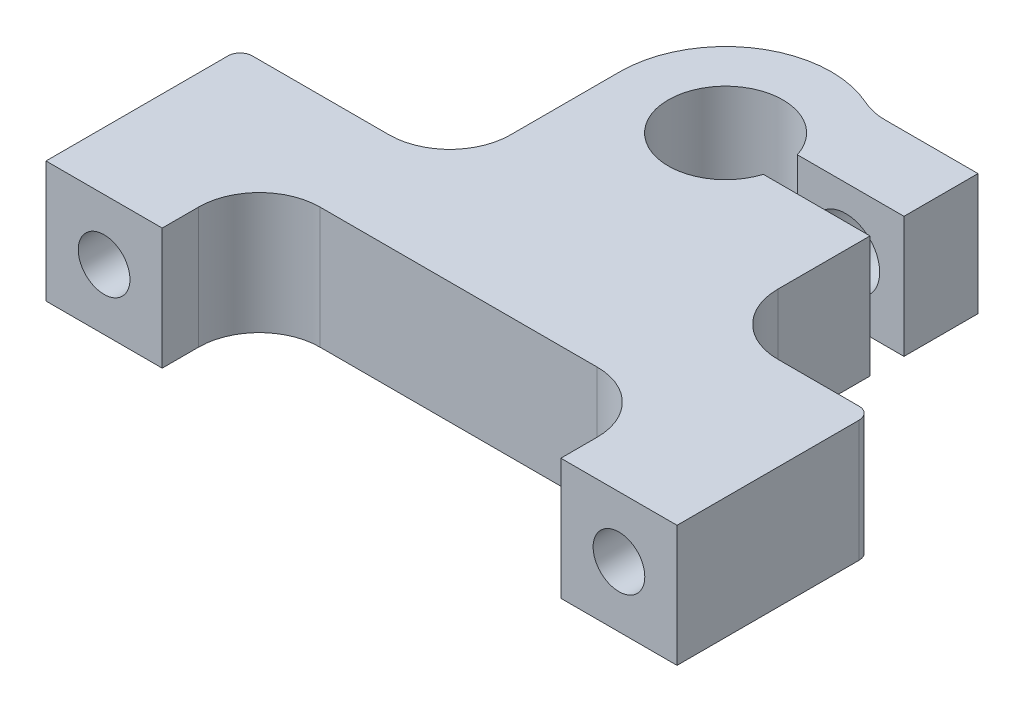
ISO-10303-21;
HEADER;
FILE_DESCRIPTION(('STEP AP214'),'2;1');
FILE_NAME('part.step','',(''),(''),'','','');
FILE_SCHEMA(('AUTOMOTIVE_DESIGN { 1 0 10303 214 1 1 1 1 }'));
ENDSEC;
DATA;
#1=APPLICATION_CONTEXT('core data for automotive mechanical design processes');
#2=APPLICATION_PROTOCOL_DEFINITION('international standard','automotive_design',2000,#1);
#3=PRODUCT_CONTEXT('',#1,'mechanical');
#4=PRODUCT('Part','Part','',(#3));
#5=PRODUCT_RELATED_PRODUCT_CATEGORY('part','',(#4));
#6=PRODUCT_DEFINITION_FORMATION('','',#4);
#7=PRODUCT_DEFINITION_CONTEXT('part definition',#1,'design');
#8=PRODUCT_DEFINITION('design','',#6,#7);
#9=PRODUCT_DEFINITION_SHAPE('','',#8);
#10=(LENGTH_UNIT() NAMED_UNIT(*) SI_UNIT(.MILLI.,.METRE.));
#11=(NAMED_UNIT(*) PLANE_ANGLE_UNIT() SI_UNIT($,.RADIAN.));
#12=(NAMED_UNIT(*) SI_UNIT($,.STERADIAN.) SOLID_ANGLE_UNIT());
#13=UNCERTAINTY_MEASURE_WITH_UNIT(LENGTH_MEASURE(1.E-05),#10,'distance_accuracy_value','');
#14=(GEOMETRIC_REPRESENTATION_CONTEXT(3) GLOBAL_UNCERTAINTY_ASSIGNED_CONTEXT((#13)) GLOBAL_UNIT_ASSIGNED_CONTEXT((#10,
#11,#12)) REPRESENTATION_CONTEXT('',''));
#15=CARTESIAN_POINT('',(0.,0.,0.));
#16=DIRECTION('',(0.,0.,1.));
#17=DIRECTION('',(1.,0.,0.));
#18=AXIS2_PLACEMENT_3D('',#15,#16,#17);
#19=CARTESIAN_POINT('',(-13.4703841816038,3.175,11.4300000000753));
#20=DIRECTION('',(0.,0.,1.));
#21=DIRECTION('',(1.,0.,0.));
#22=AXIS2_PLACEMENT_3D('',#19,#20,#21);
#23=CONICAL_SURFACE('',#22,1.35255000006575,1.02974425864684);
#24=CARTESIAN_POINT('',(-13.4703841816588,3.175,10.6173059697596));
#25=VERTEX_POINT('',#24);
#26=VERTEX_LOOP('',#25);
#27=FACE_BOUND('',#26,.T.);
#28=CARTESIAN_POINT('',(-13.4703841816038,3.175,11.43));
#29=DIRECTION('',(0.,0.,1.));
#30=DIRECTION('',(1.,0.,0.));
#31=AXIS2_PLACEMENT_3D('',#28,#29,#30);
#32=CIRCLE('',#31,1.35254999999999);
#33=CARTESIAN_POINT('',(-12.1178341816038,3.175,11.43));
#34=VERTEX_POINT('',#33);
#35=EDGE_CURVE('E438',#34,#34,#32,.T.);
#36=ORIENTED_EDGE('',*,*,#35,.T.);
#37=EDGE_LOOP('',(#36));
#38=FACE_BOUND('',#37,.T.);
#39=ADVANCED_FACE('F17',(#27,#38),#23,.F.);
#40=CARTESIAN_POINT('',(13.4703841816037,3.175,11.4300000000185));
#41=DIRECTION('',(0.,0.,1.));
#42=DIRECTION('',(1.,0.,0.));
#43=AXIS2_PLACEMENT_3D('',#40,#41,#42);
#44=CONICAL_SURFACE('',#43,1.35255000000534,1.02974425867032);
#45=CARTESIAN_POINT('',(13.470384181602,3.175,10.6173059697312));
#46=VERTEX_POINT('',#45);
#47=VERTEX_LOOP('',#46);
#48=FACE_BOUND('',#47,.T.);
#49=CARTESIAN_POINT('',(13.4703841816037,3.175,11.43));
#50=DIRECTION('',(0.,0.,1.));
#51=DIRECTION('',(1.,0.,0.));
#52=AXIS2_PLACEMENT_3D('',#49,#50,#51);
#53=CIRCLE('',#52,1.35254999999999);
#54=CARTESIAN_POINT('',(14.8229341816037,3.175,11.43));
#55=VERTEX_POINT('',#54);
#56=EDGE_CURVE('E435',#55,#55,#53,.T.);
#57=ORIENTED_EDGE('',*,*,#56,.T.);
#58=EDGE_LOOP('',(#57));
#59=FACE_BOUND('',#58,.T.);
#60=ADVANCED_FACE('F664',(#48,#59),#44,.F.);
#61=CARTESIAN_POINT('',(5.3975,3.175,9.52500000011014));
#62=DIRECTION('',(0.,0.,-1.));
#63=DIRECTION('',(-1.,0.,0.));
#64=AXIS2_PLACEMENT_3D('',#61,#62,#63);
#65=CONICAL_SURFACE('',#64,1.35254999979312,1.02974425840088);
#66=CARTESIAN_POINT('',(5.39749999978767,3.175,10.3376940303406));
#67=VERTEX_POINT('',#66);
#68=VERTEX_LOOP('',#67);
#69=FACE_BOUND('',#68,.T.);
#70=CARTESIAN_POINT('',(5.3975,3.175,9.525));
#71=DIRECTION('',(0.,0.,-1.));
#72=DIRECTION('',(-1.,0.,0.));
#73=AXIS2_PLACEMENT_3D('',#70,#71,#72);
#74=CIRCLE('',#73,1.35254999999999);
#75=CARTESIAN_POINT('',(4.04495000000001,3.175,9.525));
#76=VERTEX_POINT('',#75);
#77=EDGE_CURVE('E431',#76,#76,#74,.T.);
#78=ORIENTED_EDGE('',*,*,#77,.T.);
#79=EDGE_LOOP('',(#78));
#80=FACE_BOUND('',#79,.T.);
#81=ADVANCED_FACE('F661',(#69,#80),#65,.F.);
#82=CARTESIAN_POINT('',(-13.4703841816038,3.175,19.05));
#83=DIRECTION('',(0.,0.,1.));
#84=DIRECTION('',(1.,0.,0.));
#85=AXIS2_PLACEMENT_3D('',#82,#83,#84);
#86=CYLINDRICAL_SURFACE('',#85,1.35254999999999);
#87=ORIENTED_EDGE('',*,*,#35,.F.);
#88=EDGE_LOOP('',(#87));
#89=FACE_BOUND('',#88,.T.);
#90=CARTESIAN_POINT('',(-13.4703841816038,3.175,19.05));
#91=DIRECTION('',(0.,0.,1.));
#92=DIRECTION('',(1.,0.,0.));
#93=AXIS2_PLACEMENT_3D('',#90,#91,#92);
#94=CIRCLE('',#93,1.35254999999999);
#95=CARTESIAN_POINT('',(-12.1178341816038,3.175,19.05));
#96=VERTEX_POINT('',#95);
#97=EDGE_CURVE('E394',#96,#96,#94,.T.);
#98=ORIENTED_EDGE('',*,*,#97,.T.);
#99=EDGE_LOOP('',(#98));
#100=FACE_BOUND('',#99,.T.);
#101=ADVANCED_FACE('F657',(#89,#100),#86,.F.);
#102=CARTESIAN_POINT('',(13.4703841816037,3.175,19.05));
#103=DIRECTION('',(0.,0.,1.));
#104=DIRECTION('',(1.,0.,0.));
#105=AXIS2_PLACEMENT_3D('',#102,#103,#104);
#106=CYLINDRICAL_SURFACE('',#105,1.35254999999999);
#107=ORIENTED_EDGE('',*,*,#56,.F.);
#108=EDGE_LOOP('',(#107));
#109=FACE_BOUND('',#108,.T.);
#110=CARTESIAN_POINT('',(13.4703841816037,3.175,19.05));
#111=DIRECTION('',(0.,0.,1.));
#112=DIRECTION('',(1.,0.,0.));
#113=AXIS2_PLACEMENT_3D('',#110,#111,#112);
#114=CIRCLE('',#113,1.35254999999999);
#115=CARTESIAN_POINT('',(14.8229341816037,3.175,19.05));
#116=VERTEX_POINT('',#115);
#117=EDGE_CURVE('E364',#116,#116,#114,.T.);
#118=ORIENTED_EDGE('',*,*,#117,.T.);
#119=EDGE_LOOP('',(#118));
#120=FACE_BOUND('',#119,.T.);
#121=ADVANCED_FACE('F653',(#109,#120),#106,.F.);
#122=CARTESIAN_POINT('',(15.875,6.35,9.52499999999999));
#123=DIRECTION('',(0.,-1.,0.));
#124=DIRECTION('',(0.,0.,-1.));
#125=AXIS2_PLACEMENT_3D('',#122,#123,#124);
#126=CYLINDRICAL_SURFACE('',#125,0.635);
#127=CARTESIAN_POINT('',(15.875,0.,9.52499999999999));
#128=DIRECTION('',(0.,-1.,0.));
#129=DIRECTION('',(0.,0.,-1.));
#130=AXIS2_PLACEMENT_3D('',#127,#128,#129);
#131=CIRCLE('',#130,0.635);
#132=CARTESIAN_POINT('',(16.51,0.,9.52499999999999));
#133=VERTEX_POINT('',#132);
#134=CARTESIAN_POINT('',(15.875,0.,8.88999999999999));
#135=VERTEX_POINT('',#134);
#136=EDGE_CURVE('E20',#133,#135,#131,.F.);
#137=ORIENTED_EDGE('',*,*,#136,.T.);
#138=DIRECTION('',(0.,1.,0.));
#139=VECTOR('',#138,1.);
#140=CARTESIAN_POINT('',(15.875,6.35,8.88999999999999));
#141=LINE('',#140,#139);
#142=CARTESIAN_POINT('',(15.875,6.35,8.88999999999999));
#143=VERTEX_POINT('',#142);
#144=EDGE_CURVE('E347',#135,#143,#141,.T.);
#145=ORIENTED_EDGE('',*,*,#144,.T.);
#146=CARTESIAN_POINT('',(15.875,6.35,9.52499999999999));
#147=DIRECTION('',(0.,-1.,0.));
#148=DIRECTION('',(0.,0.,-1.));
#149=AXIS2_PLACEMENT_3D('',#146,#147,#148);
#150=CIRCLE('',#149,0.635);
#151=CARTESIAN_POINT('',(16.51,6.35,9.52499999999999));
#152=VERTEX_POINT('',#151);
#153=EDGE_CURVE('E473',#152,#143,#150,.F.);
#154=ORIENTED_EDGE('',*,*,#153,.F.);
#155=DIRECTION('',(0.,1.,0.));
#156=VECTOR('',#155,1.);
#157=CARTESIAN_POINT('',(16.51,6.35,9.52499999999999));
#158=LINE('',#157,#156);
#159=EDGE_CURVE('E350',#152,#133,#158,.F.);
#160=ORIENTED_EDGE('',*,*,#159,.T.);
#161=EDGE_LOOP('',(#137,#145,#154,#160));
#162=FACE_BOUND('',#161,.T.);
#163=ADVANCED_FACE('F646',(#162),#126,.T.);
#164=CARTESIAN_POINT('',(5.3975,3.175,0.888999999999999));
#165=DIRECTION('',(0.,0.,-1.));
#166=DIRECTION('',(-1.,0.,0.));
#167=AXIS2_PLACEMENT_3D('',#164,#165,#166);
#168=CYLINDRICAL_SURFACE('',#167,1.35254999999999);
#169=ORIENTED_EDGE('',*,*,#77,.F.);
#170=EDGE_LOOP('',(#169));
#171=FACE_BOUND('',#170,.T.);
#172=CARTESIAN_POINT('',(5.3975,3.175,0.888999999999998));
#173=DIRECTION('',(0.,0.,-1.));
#174=DIRECTION('',(-1.,0.,0.));
#175=AXIS2_PLACEMENT_3D('',#172,#173,#174);
#176=CIRCLE('',#175,1.35254999999999);
#177=CARTESIAN_POINT('',(4.04495000000001,3.175,0.888999999999998));
#178=VERTEX_POINT('',#177);
#179=EDGE_CURVE('E227',#178,#178,#176,.T.);
#180=ORIENTED_EDGE('',*,*,#179,.T.);
#181=EDGE_LOOP('',(#180));
#182=FACE_BOUND('',#181,.T.);
#183=ADVANCED_FACE('F641',(#171,#182),#168,.F.);
#184=CARTESIAN_POINT('',(5.3975,3.175,-4.7625));
#185=DIRECTION('',(0.,0.,-1.));
#186=DIRECTION('',(-1.,0.,0.));
#187=AXIS2_PLACEMENT_3D('',#184,#185,#186);
#188=CYLINDRICAL_SURFACE('',#187,1.77799999999999);
#189=CARTESIAN_POINT('',(5.3975,3.175,-0.889));
#190=DIRECTION('',(0.,0.,-1.));
#191=DIRECTION('',(-1.,0.,0.));
#192=AXIS2_PLACEMENT_3D('',#189,#190,#191);
#193=CIRCLE('',#192,1.77799999999999);
#194=CARTESIAN_POINT('',(3.6195,3.175,-0.889));
#195=VERTEX_POINT('',#194);
#196=EDGE_CURVE('E334',#195,#195,#193,.F.);
#197=ORIENTED_EDGE('',*,*,#196,.T.);
#198=EDGE_LOOP('',(#197));
#199=FACE_BOUND('',#198,.T.);
#200=CARTESIAN_POINT('',(5.3975,3.175,-4.7625));
#201=DIRECTION('',(0.,0.,-1.));
#202=DIRECTION('',(-1.,0.,0.));
#203=AXIS2_PLACEMENT_3D('',#200,#201,#202);
#204=CIRCLE('',#203,1.77799999999999);
#205=CARTESIAN_POINT('',(3.6195,3.175,-4.7625));
#206=VERTEX_POINT('',#205);
#207=EDGE_CURVE('E314',#206,#206,#204,.T.);
#208=ORIENTED_EDGE('',*,*,#207,.T.);
#209=EDGE_LOOP('',(#208));
#210=FACE_BOUND('',#209,.T.);
#211=ADVANCED_FACE('F637',(#199,#210),#188,.F.);
#212=CARTESIAN_POINT('',(5.3975,3.175,-5.53974));
#213=DIRECTION('',(0.,0.,1.));
#214=DIRECTION('',(1.,0.,0.));
#215=AXIS2_PLACEMENT_3D('',#212,#213,#214);
#216=CYLINDRICAL_SURFACE('',#215,3.1115);
#217=CARTESIAN_POINT('',(5.3975,3.175,-4.7625));
#218=DIRECTION('',(0.,0.,1.));
#219=DIRECTION('',(1.,0.,0.));
#220=AXIS2_PLACEMENT_3D('',#217,#218,#219);
#221=CIRCLE('',#220,3.1115);
#222=CARTESIAN_POINT('',(3.59760851366571,5.71307464181441,-4.7625));
#223=VERTEX_POINT('',#222);
#224=CARTESIAN_POINT('',(3.59760851366571,0.63692535818559,-4.7625));
#225=VERTEX_POINT('',#224);
#226=EDGE_CURVE('E306',#223,#225,#221,.T.);
#227=ORIENTED_EDGE('',*,*,#226,.T.);
#228=CARTESIAN_POINT('',(3.59760851366571,0.63692535818559,-4.7625));
#229=CARTESIAN_POINT('',(3.52834654754252,0.686026458412932,-4.76249504884835));
#230=CARTESIAN_POINT('',(3.46114883067369,0.737955759754009,-4.76476572082793));
#231=CARTESIAN_POINT('',(3.33140718670426,0.846944952510567,-4.7730137417571));
#232=CARTESIAN_POINT('',(3.26885842775554,0.903999376963681,-4.7789871801912));
#233=CARTESIAN_POINT('',(3.14892359496659,1.02268831401336,-4.79378346713445));
#234=CARTESIAN_POINT('',(3.09152650679114,1.08431251462956,-4.80260004205414));
#235=CARTESIAN_POINT('',(2.98205002803034,1.21181409508648,-4.82224615127086));
#236=CARTESIAN_POINT('',(2.92997200974733,1.27769256539487,-4.83307620301587));
#237=CARTESIAN_POINT('',(2.78245173473631,1.48064258714837,-4.86727022211626));
#238=CARTESIAN_POINT('',(2.69524013516089,1.62350916446136,-4.89241038782804));
#239=CARTESIAN_POINT('',(2.54476839745028,1.92153115164959,-4.94109478916526));
#240=CARTESIAN_POINT('',(2.48149469570099,2.07667954199447,-4.96463992233498));
#241=CARTESIAN_POINT('',(2.40903340593833,2.30562290671702,-4.99327561710349));
#242=CARTESIAN_POINT('',(2.38947874005853,2.37589296304053,-5.00128008075687));
#243=CARTESIAN_POINT('',(2.35532210002134,2.51780379686435,-5.0155665829266));
#244=CARTESIAN_POINT('',(2.34071924805627,2.58944432903932,-5.02184892668514));
#245=CARTESIAN_POINT('',(2.31655641806459,2.73387703720526,-5.03238190800658));
#246=CARTESIAN_POINT('',(2.30700732052685,2.80667135324641,-5.03662816013179));
#247=CARTESIAN_POINT('',(2.29306718070819,2.95288214005153,-5.04287917362201));
#248=CARTESIAN_POINT('',(2.28867863870945,3.02629889505099,-5.04488284843869));
#249=CARTESIAN_POINT('',(2.28690882200668,3.09980177269294,-5.04566817254445));
#250=B_SPLINE_CURVE_WITH_KNOTS('',3,(#228,#229,#230,#231,#232,#233,#234,#235,#236,#237,#238,
#239,#240,#241,#242,#243,#244,#245,#246,#247,#248,#249),.UNSPECIFIED.,.F.,.F.,(4,2,2,2,2,2,2,2,
2,2,4),(0.,0.25453010242984,0.508791850891489,0.76249634769883,1.0162661349554,1.52177503780393,
2.02699708031349,2.24697122036493,2.4669063452065,2.68731307306073,2.90782654373643),.UNSPECIFIED.);
#251=CARTESIAN_POINT('',(2.28690882200668,3.09980177269294,-5.04566817254445));
#252=VERTEX_POINT('',#251);
#253=EDGE_CURVE('E477',#225,#252,#250,.T.);
#254=ORIENTED_EDGE('',*,*,#253,.T.);
#255=CARTESIAN_POINT('',(2.28690882200668,3.25019822730706,-5.04566817254445));
#256=CARTESIAN_POINT('',(2.28630294066889,3.22513215153804,-5.04594271765496));
#257=CARTESIAN_POINT('',(2.286,3.20006607576902,-5.04607999021022));
#258=CARTESIAN_POINT('',(2.286,3.14993392423098,-5.04607999021023));
#259=CARTESIAN_POINT('',(2.28630294066889,3.12486784846196,-5.04594271765499));
#260=CARTESIAN_POINT('',(2.28690882200668,3.09980177269294,-5.04566817254449));
#261=B_SPLINE_CURVE_WITH_KNOTS('',3,(#255,#256,#257,#258,#259,#260),.UNSPECIFIED.,.F.,.F.,(4,2,
4),(0.,0.0752048465283555,0.15040969305671),.UNSPECIFIED.);
#262=CARTESIAN_POINT('',(2.28690882200668,3.25019822730706,-5.04566817254445));
#263=VERTEX_POINT('',#262);
#264=EDGE_CURVE('E434',#263,#252,#261,.T.);
#265=ORIENTED_EDGE('',*,*,#264,.F.);
#266=CARTESIAN_POINT('',(2.28690882200668,3.25019822730706,-5.04566817254445));
#267=CARTESIAN_POINT('',(2.28896134277044,3.3356252153242,-5.04476823160055));
#268=CARTESIAN_POINT('',(2.29455696007797,3.42093043263532,-5.04220480140177));
#269=CARTESIAN_POINT('',(2.31270473304478,3.59060087858085,-5.03408955608365));
#270=CARTESIAN_POINT('',(2.32525239781625,3.67496667820867,-5.02853967022325));
#271=CARTESIAN_POINT('',(2.35713777707695,3.84196525988083,-5.01480522359978));
#272=CARTESIAN_POINT('',(2.3764584816506,3.92460183883104,-5.00662726725914));
#273=CARTESIAN_POINT('',(2.42169565675205,4.08779664357707,-4.98818655225455));
#274=CARTESIAN_POINT('',(2.44761301119143,4.16835458925401,-4.97792351423935));
#275=CARTESIAN_POINT('',(2.5348570617138,4.40588937635793,-4.94499835455634));
#276=CARTESIAN_POINT('',(2.60575909513237,4.5591583500007,-4.92015888001431));
#277=CARTESIAN_POINT('',(2.77128385393182,4.8521273855147,-4.87070247525149));
#278=CARTESIAN_POINT('',(2.86589339516181,4.99183492941655,-4.84608542919166));
#279=CARTESIAN_POINT('',(3.06106339854825,5.23483311599247,-4.80683368736436));
#280=CARTESIAN_POINT('',(3.15853789823418,5.34043209629326,-4.79125074645017));
#281=CARTESIAN_POINT('',(3.31543297822947,5.48835706083474,-4.77462499612224));
#282=CARTESIAN_POINT('',(3.36958167353395,5.53596945324459,-4.77020665077452));
#283=CARTESIAN_POINT('',(3.48118859249706,5.62742652205617,-4.76414224419159));
#284=CARTESIAN_POINT('',(3.53864946989156,5.67126810517135,-4.76249843877736));
#285=CARTESIAN_POINT('',(3.59760851366571,5.71307464181441,-4.7625));
#286=B_SPLINE_CURVE_WITH_KNOTS('',3,(#266,#267,#268,#269,#270,#271,#272,#273,#274,#275,#276,
#277,#278,#279,#280,#281,#282,#283,#284,#285),.UNSPECIFIED.,.F.,.F.,(4,2,2,2,2,2,2,2,2,4),(0.,
0.256251856672941,0.512338372291173,0.767786302139486,1.02326847851726,1.53292584296418,
2.04230040480996,2.47431515590913,2.6908308467005,2.9075224894692),.UNSPECIFIED.);
#287=EDGE_CURVE('E502',#263,#223,#286,.T.);
#288=ORIENTED_EDGE('',*,*,#287,.T.);
#289=EDGE_LOOP('',(#227,#254,#265,#288));
#290=FACE_BOUND('',#289,.T.);
#291=ADVANCED_FACE('F487',(#290),#216,.F.);
#292=CARTESIAN_POINT('',(3.59760851366571,6.35,-7.9375));
#293=DIRECTION('',(0.,-1.,0.));
#294=DIRECTION('',(0.,0.,-1.));
#295=AXIS2_PLACEMENT_3D('',#292,#293,#294);
#296=CYLINDRICAL_SURFACE('',#295,3.175);
#297=DIRECTION('',(0.,-1.,0.));
#298=VECTOR('',#297,1.);
#299=CARTESIAN_POINT('',(2.28690882200668,6.35,-5.04566817254445));
#300=LINE('',#299,#298);
#301=CARTESIAN_POINT('',(2.28690882200668,6.35,-5.04566817254445));
#302=VERTEX_POINT('',#301);
#303=EDGE_CURVE('E300',#302,#263,#300,.T.);
#304=ORIENTED_EDGE('',*,*,#303,.F.);
#305=CARTESIAN_POINT('',(3.59760851366571,6.35,-7.9375));
#306=DIRECTION('',(0.,-1.,0.));
#307=DIRECTION('',(0.,0.,-1.));
#308=AXIS2_PLACEMENT_3D('',#305,#306,#307);
#309=CIRCLE('',#308,3.175);
#310=CARTESIAN_POINT('',(3.59760851366571,6.35,-4.7625));
#311=VERTEX_POINT('',#310);
#312=EDGE_CURVE('E470',#311,#302,#309,.T.);
#313=ORIENTED_EDGE('',*,*,#312,.F.);
#314=DIRECTION('',(0.,1.,0.));
#315=VECTOR('',#314,1.);
#316=CARTESIAN_POINT('',(3.59760851366571,6.35,-4.7625));
#317=LINE('',#316,#315);
#318=EDGE_CURVE('E307',#311,#223,#317,.F.);
#319=ORIENTED_EDGE('',*,*,#318,.T.);
#320=ORIENTED_EDGE('',*,*,#287,.F.);
#321=EDGE_LOOP('',(#304,#313,#319,#320));
#322=FACE_BOUND('',#321,.T.);
#323=ADVANCED_FACE('F496',(#322),#296,.F.);
#324=CARTESIAN_POINT('',(3.59760851366571,6.35,-7.9375));
#325=DIRECTION('',(0.,-1.,0.));
#326=DIRECTION('',(0.,0.,-1.));
#327=AXIS2_PLACEMENT_3D('',#324,#325,#326);
#328=CYLINDRICAL_SURFACE('',#327,3.175);
#329=DIRECTION('',(0.,1.,0.));
#330=VECTOR('',#329,1.);
#331=CARTESIAN_POINT('',(3.59760851366571,6.35,-4.7625));
#332=LINE('',#331,#330);
#333=CARTESIAN_POINT('',(3.59760851366571,0.,-4.7625));
#334=VERTEX_POINT('',#333);
#335=EDGE_CURVE('E303',#225,#334,#332,.F.);
#336=ORIENTED_EDGE('',*,*,#335,.T.);
#337=CARTESIAN_POINT('',(3.59760851366571,0.,-7.9375));
#338=DIRECTION('',(0.,-1.,0.));
#339=DIRECTION('',(0.,0.,-1.));
#340=AXIS2_PLACEMENT_3D('',#337,#338,#339);
#341=CIRCLE('',#340,3.175);
#342=CARTESIAN_POINT('',(2.28690882200668,0.,-5.04566817254445));
#343=VERTEX_POINT('',#342);
#344=EDGE_CURVE('E485',#343,#334,#341,.F.);
#345=ORIENTED_EDGE('',*,*,#344,.F.);
#346=DIRECTION('',(0.,-1.,0.));
#347=VECTOR('',#346,1.);
#348=CARTESIAN_POINT('',(2.28690882200668,6.35,-5.04566817254445));
#349=LINE('',#348,#347);
#350=EDGE_CURVE('E297',#252,#343,#349,.T.);
#351=ORIENTED_EDGE('',*,*,#350,.F.);
#352=ORIENTED_EDGE('',*,*,#253,.F.);
#353=EDGE_LOOP('',(#336,#345,#351,#352));
#354=FACE_BOUND('',#353,.T.);
#355=ADVANCED_FACE('F491',(#354),#328,.F.);
#356=CARTESIAN_POINT('',(-15.875,6.35,9.525));
#357=DIRECTION('',(0.,-1.,0.));
#358=DIRECTION('',(0.,0.,-1.));
#359=AXIS2_PLACEMENT_3D('',#356,#357,#358);
#360=CYLINDRICAL_SURFACE('',#359,0.635);
#361=CARTESIAN_POINT('',(-15.875,0.,9.525));
#362=DIRECTION('',(0.,-1.,0.));
#363=DIRECTION('',(0.,0.,-1.));
#364=AXIS2_PLACEMENT_3D('',#361,#362,#363);
#365=CIRCLE('',#364,0.635);
#366=CARTESIAN_POINT('',(-15.875,0.,8.89));
#367=VERTEX_POINT('',#366);
#368=CARTESIAN_POINT('',(-16.51,0.,9.525));
#369=VERTEX_POINT('',#368);
#370=EDGE_CURVE('E35',#367,#369,#365,.F.);
#371=ORIENTED_EDGE('',*,*,#370,.T.);
#372=DIRECTION('',(0.,1.,0.));
#373=VECTOR('',#372,1.);
#374=CARTESIAN_POINT('',(-16.51,6.35,9.525));
#375=LINE('',#374,#373);
#376=CARTESIAN_POINT('',(-16.51,6.35,9.525));
#377=VERTEX_POINT('',#376);
#378=EDGE_CURVE('E272',#369,#377,#375,.T.);
#379=ORIENTED_EDGE('',*,*,#378,.T.);
#380=CARTESIAN_POINT('',(-15.875,6.35,9.525));
#381=DIRECTION('',(0.,-1.,0.));
#382=DIRECTION('',(0.,0.,-1.));
#383=AXIS2_PLACEMENT_3D('',#380,#381,#382);
#384=CIRCLE('',#383,0.635);
#385=CARTESIAN_POINT('',(-15.875,6.35,8.89));
#386=VERTEX_POINT('',#385);
#387=EDGE_CURVE('E194',#386,#377,#384,.F.);
#388=ORIENTED_EDGE('',*,*,#387,.F.);
#389=DIRECTION('',(0.,1.,0.));
#390=VECTOR('',#389,1.);
#391=CARTESIAN_POINT('',(-15.875,6.35,8.89));
#392=LINE('',#391,#390);
#393=EDGE_CURVE('E277',#386,#367,#392,.F.);
#394=ORIENTED_EDGE('',*,*,#393,.T.);
#395=EDGE_LOOP('',(#371,#379,#388,#394));
#396=FACE_BOUND('',#395,.T.);
#397=ADVANCED_FACE('F495',(#396),#360,.T.);
#398=CARTESIAN_POINT('',(0.,6.35,0.));
#399=DIRECTION('',(0.,1.,0.));
#400=DIRECTION('',(0.,0.,1.));
#401=AXIS2_PLACEMENT_3D('',#398,#399,#400);
#402=PLANE('',#401);
#403=DIRECTION('',(0.,0.,-1.));
#404=VECTOR('',#403,1.);
#405=CARTESIAN_POINT('',(-5.53974,6.35,0.));
#406=LINE('',#405,#404);
#407=CARTESIAN_POINT('',(-5.53974,6.35,0.));
#408=VERTEX_POINT('',#407);
#409=CARTESIAN_POINT('',(-5.53974,6.35,5.715));
#410=VERTEX_POINT('',#409);
#411=EDGE_CURVE('E292',#408,#410,#406,.F.);
#412=ORIENTED_EDGE('',*,*,#411,.T.);
#413=CARTESIAN_POINT('',(-8.71474,6.35,5.715));
#414=DIRECTION('',(0.,1.,0.));
#415=DIRECTION('',(0.,0.,1.));
#416=AXIS2_PLACEMENT_3D('',#413,#414,#415);
#417=CIRCLE('',#416,3.175);
#418=CARTESIAN_POINT('',(-8.71474,6.35,8.89));
#419=VERTEX_POINT('',#418);
#420=EDGE_CURVE('E287',#410,#419,#417,.F.);
#421=ORIENTED_EDGE('',*,*,#420,.T.);
#422=DIRECTION('',(1.,0.,0.));
#423=VECTOR('',#422,1.);
#424=CARTESIAN_POINT('',(-5.53974,6.35,8.89));
#425=LINE('',#424,#423);
#426=EDGE_CURVE('E286',#419,#386,#425,.F.);
#427=ORIENTED_EDGE('',*,*,#426,.T.);
#428=ORIENTED_EDGE('',*,*,#387,.T.);
#429=DIRECTION('',(0.,0.,-1.));
#430=VECTOR('',#429,1.);
#431=CARTESIAN_POINT('',(-16.51,6.35,8.89));
#432=LINE('',#431,#430);
#433=CARTESIAN_POINT('',(-16.51,6.35,19.05));
#434=VERTEX_POINT('',#433);
#435=EDGE_CURVE('E274',#377,#434,#432,.F.);
#436=ORIENTED_EDGE('',*,*,#435,.T.);
#437=DIRECTION('',(-1.,0.,0.));
#438=VECTOR('',#437,1.);
#439=CARTESIAN_POINT('',(-16.51,6.35,19.05));
#440=LINE('',#439,#438);
#441=CARTESIAN_POINT('',(-10.42924,6.35,19.05));
#442=VERTEX_POINT('',#441);
#443=EDGE_CURVE('E387',#434,#442,#440,.F.);
#444=ORIENTED_EDGE('',*,*,#443,.T.);
#445=DIRECTION('',(0.,0.,1.));
#446=VECTOR('',#445,1.);
#447=CARTESIAN_POINT('',(-10.42924,6.35,19.05));
#448=LINE('',#447,#446);
#449=CARTESIAN_POINT('',(-10.42924,6.35,17.145));
#450=VERTEX_POINT('',#449);
#451=EDGE_CURVE('E383',#442,#450,#448,.F.);
#452=ORIENTED_EDGE('',*,*,#451,.T.);
#453=CARTESIAN_POINT('',(-7.25424,6.35,17.145));
#454=DIRECTION('',(0.,1.,0.));
#455=DIRECTION('',(0.,0.,1.));
#456=AXIS2_PLACEMENT_3D('',#453,#454,#455);
#457=CIRCLE('',#456,3.175);
#458=CARTESIAN_POINT('',(-7.25424,6.35,13.97));
#459=VERTEX_POINT('',#458);
#460=EDGE_CURVE('E379',#450,#459,#457,.F.);
#461=ORIENTED_EDGE('',*,*,#460,.T.);
#462=DIRECTION('',(-1.,0.,0.));
#463=VECTOR('',#462,1.);
#464=CARTESIAN_POINT('',(-10.42924,6.35,13.97));
#465=LINE('',#464,#463);
#466=CARTESIAN_POINT('',(7.25424,6.35,13.97));
#467=VERTEX_POINT('',#466);
#468=EDGE_CURVE('E375',#459,#467,#465,.F.);
#469=ORIENTED_EDGE('',*,*,#468,.T.);
#470=CARTESIAN_POINT('',(7.25424,6.35,17.145));
#471=DIRECTION('',(0.,1.,0.));
#472=DIRECTION('',(0.,0.,1.));
#473=AXIS2_PLACEMENT_3D('',#470,#471,#472);
#474=CIRCLE('',#473,3.175);
#475=CARTESIAN_POINT('',(10.42924,6.35,17.145));
#476=VERTEX_POINT('',#475);
#477=EDGE_CURVE('E371',#467,#476,#474,.F.);
#478=ORIENTED_EDGE('',*,*,#477,.T.);
#479=DIRECTION('',(0.,0.,-1.));
#480=VECTOR('',#479,1.);
#481=CARTESIAN_POINT('',(10.42924,6.35,13.97));
#482=LINE('',#481,#480);
#483=CARTESIAN_POINT('',(10.42924,6.35,19.05));
#484=VERTEX_POINT('',#483);
#485=EDGE_CURVE('E370',#476,#484,#482,.F.);
#486=ORIENTED_EDGE('',*,*,#485,.T.);
#487=DIRECTION('',(-1.,0.,0.));
#488=VECTOR('',#487,1.);
#489=CARTESIAN_POINT('',(10.42924,6.35,19.05));
#490=LINE('',#489,#488);
#491=CARTESIAN_POINT('',(16.51,6.35,19.05));
#492=VERTEX_POINT('',#491);
#493=EDGE_CURVE('E354',#484,#492,#490,.F.);
#494=ORIENTED_EDGE('',*,*,#493,.T.);
#495=DIRECTION('',(0.,0.,1.));
#496=VECTOR('',#495,1.);
#497=CARTESIAN_POINT('',(16.51,6.35,19.05));
#498=LINE('',#497,#496);
#499=EDGE_CURVE('E352',#492,#152,#498,.F.);
#500=ORIENTED_EDGE('',*,*,#499,.T.);
#501=ORIENTED_EDGE('',*,*,#153,.T.);
#502=DIRECTION('',(1.,0.,0.));
#503=VECTOR('',#502,1.);
#504=CARTESIAN_POINT('',(16.51,6.35,8.88999999999999));
#505=LINE('',#504,#503);
#506=CARTESIAN_POINT('',(11.6205,6.35,8.89));
#507=VERTEX_POINT('',#506);
#508=EDGE_CURVE('E346',#143,#507,#505,.F.);
#509=ORIENTED_EDGE('',*,*,#508,.T.);
#510=CARTESIAN_POINT('',(11.6205,6.35,5.715));
#511=DIRECTION('',(0.,1.,0.));
#512=DIRECTION('',(0.,0.,1.));
#513=AXIS2_PLACEMENT_3D('',#510,#511,#512);
#514=CIRCLE('',#513,3.175);
#515=CARTESIAN_POINT('',(8.4455,6.35,5.715));
#516=VERTEX_POINT('',#515);
#517=EDGE_CURVE('E342',#507,#516,#514,.F.);
#518=ORIENTED_EDGE('',*,*,#517,.T.);
#519=DIRECTION('',(0.,0.,1.));
#520=VECTOR('',#519,1.);
#521=CARTESIAN_POINT('',(8.4455,6.35,8.89));
#522=LINE('',#521,#520);
#523=CARTESIAN_POINT('',(8.4455,6.35,0.888999999999999));
#524=VERTEX_POINT('',#523);
#525=EDGE_CURVE('E341',#516,#524,#522,.F.);
#526=ORIENTED_EDGE('',*,*,#525,.T.);
#527=DIRECTION('',(1.,0.,0.));
#528=VECTOR('',#527,1.);
#529=CARTESIAN_POINT('',(8.4455,6.35,0.888999999999999));
#530=LINE('',#529,#528);
#531=CARTESIAN_POINT('',(2.86498151261051,6.35,0.889));
#532=VERTEX_POINT('',#531);
#533=EDGE_CURVE('E223',#524,#532,#530,.F.);
#534=ORIENTED_EDGE('',*,*,#533,.T.);
#535=CARTESIAN_POINT('',(0.,6.35,0.));
#536=DIRECTION('',(0.,-1.,0.));
#537=DIRECTION('',(0.,0.,-1.));
#538=AXIS2_PLACEMENT_3D('',#535,#536,#537);
#539=CIRCLE('',#538,2.99974);
#540=CARTESIAN_POINT('',(2.86498151261051,6.35,-0.889));
#541=VERTEX_POINT('',#540);
#542=EDGE_CURVE('E336',#532,#541,#539,.T.);
#543=ORIENTED_EDGE('',*,*,#542,.T.);
#544=DIRECTION('',(-1.,0.,0.));
#545=VECTOR('',#544,1.);
#546=CARTESIAN_POINT('',(2.86498151261051,6.35,-0.889));
#547=LINE('',#546,#545);
#548=CARTESIAN_POINT('',(8.4455,6.35,-0.889));
#549=VERTEX_POINT('',#548);
#550=EDGE_CURVE('E328',#541,#549,#547,.F.);
#551=ORIENTED_EDGE('',*,*,#550,.T.);
#552=DIRECTION('',(0.,0.,1.));
#553=VECTOR('',#552,1.);
#554=CARTESIAN_POINT('',(8.4455,6.35,-0.889));
#555=LINE('',#554,#553);
#556=CARTESIAN_POINT('',(8.4455,6.35,-4.7625));
#557=VERTEX_POINT('',#556);
#558=EDGE_CURVE('E327',#549,#557,#555,.F.);
#559=ORIENTED_EDGE('',*,*,#558,.T.);
#560=DIRECTION('',(1.,0.,0.));
#561=VECTOR('',#560,1.);
#562=CARTESIAN_POINT('',(8.4455,6.35,-4.7625));
#563=LINE('',#562,#561);
#564=EDGE_CURVE('E310',#557,#311,#563,.F.);
#565=ORIENTED_EDGE('',*,*,#564,.T.);
#566=ORIENTED_EDGE('',*,*,#312,.T.);
#567=CARTESIAN_POINT('',(0.,6.35,0.));
#568=DIRECTION('',(0.,-1.,0.));
#569=DIRECTION('',(0.,0.,-1.));
#570=AXIS2_PLACEMENT_3D('',#567,#568,#569);
#571=CIRCLE('',#570,5.53974);
#572=EDGE_CURVE('E296',#408,#302,#571,.T.);
#573=ORIENTED_EDGE('',*,*,#572,.F.);
#574=EDGE_LOOP('',(#412,#421,#427,#428,#436,#444,#452,#461,#469,#478,#486,#494,#500,#501,#509,
#518,#526,#534,#543,#551,#559,#565,#566,#573));
#575=FACE_BOUND('',#574,.T.);
#576=ADVANCED_FACE('F575',(#575),#402,.T.);
#577=CARTESIAN_POINT('',(-16.51,6.35,19.05));
#578=DIRECTION('',(0.,0.,-1.));
#579=DIRECTION('',(-1.,0.,0.));
#580=AXIS2_PLACEMENT_3D('',#577,#578,#579);
#581=PLANE('',#580);
#582=DIRECTION('',(0.,1.,0.));
#583=VECTOR('',#582,1.);
#584=CARTESIAN_POINT('',(-10.42924,6.35,19.05));
#585=LINE('',#584,#583);
#586=CARTESIAN_POINT('',(-10.42924,0.,19.05));
#587=VERTEX_POINT('',#586);
#588=EDGE_CURVE('E384',#587,#442,#585,.T.);
#589=ORIENTED_EDGE('',*,*,#588,.T.);
#590=ORIENTED_EDGE('',*,*,#443,.F.);
#591=DIRECTION('',(0.,1.,0.));
#592=VECTOR('',#591,1.);
#593=CARTESIAN_POINT('',(-16.51,6.35,19.05));
#594=LINE('',#593,#592);
#595=CARTESIAN_POINT('',(-16.51,0.,19.05));
#596=VERTEX_POINT('',#595);
#597=EDGE_CURVE('E275',#434,#596,#594,.F.);
#598=ORIENTED_EDGE('',*,*,#597,.T.);
#599=DIRECTION('',(1.,0.,0.));
#600=VECTOR('',#599,1.);
#601=CARTESIAN_POINT('',(0.,0.,19.05));
#602=LINE('',#601,#600);
#603=EDGE_CURVE('E201',#596,#587,#602,.T.);
#604=ORIENTED_EDGE('',*,*,#603,.T.);
#605=EDGE_LOOP('',(#589,#590,#598,#604));
#606=FACE_BOUND('',#605,.T.);
#607=ORIENTED_EDGE('',*,*,#97,.F.);
#608=EDGE_LOOP('',(#607));
#609=FACE_BOUND('',#608,.T.);
#610=ADVANCED_FACE('F572',(#606,#609),#581,.F.);
#611=CARTESIAN_POINT('',(-10.42924,6.35,19.05));
#612=DIRECTION('',(-1.,0.,0.));
#613=DIRECTION('',(0.,0.,1.));
#614=AXIS2_PLACEMENT_3D('',#611,#612,#613);
#615=PLANE('',#614);
#616=DIRECTION('',(0.,1.,0.));
#617=VECTOR('',#616,1.);
#618=CARTESIAN_POINT('',(-10.42924,6.35,17.145));
#619=LINE('',#618,#617);
#620=CARTESIAN_POINT('',(-10.42924,0.,17.145));
#621=VERTEX_POINT('',#620);
#622=EDGE_CURVE('E380',#621,#450,#619,.T.);
#623=ORIENTED_EDGE('',*,*,#622,.T.);
#624=ORIENTED_EDGE('',*,*,#451,.F.);
#625=ORIENTED_EDGE('',*,*,#588,.F.);
#626=DIRECTION('',(0.,0.,1.));
#627=VECTOR('',#626,1.);
#628=CARTESIAN_POINT('',(-10.42924,0.,0.));
#629=LINE('',#628,#627);
#630=EDGE_CURVE('E267',#587,#621,#629,.F.);
#631=ORIENTED_EDGE('',*,*,#630,.T.);
#632=EDGE_LOOP('',(#623,#624,#625,#631));
#633=FACE_BOUND('',#632,.T.);
#634=ADVANCED_FACE('F568',(#633),#615,.F.);
#635=CARTESIAN_POINT('',(-7.25424,6.35,17.145));
#636=DIRECTION('',(0.,1.,0.));
#637=DIRECTION('',(0.,0.,1.));
#638=AXIS2_PLACEMENT_3D('',#635,#636,#637);
#639=CYLINDRICAL_SURFACE('',#638,3.175);
#640=ORIENTED_EDGE('',*,*,#622,.F.);
#641=CARTESIAN_POINT('',(-7.25424,0.,17.145));
#642=DIRECTION('',(0.,1.,0.));
#643=DIRECTION('',(0.,0.,1.));
#644=AXIS2_PLACEMENT_3D('',#641,#642,#643);
#645=CIRCLE('',#644,3.175);
#646=CARTESIAN_POINT('',(-7.25424,0.,13.97));
#647=VERTEX_POINT('',#646);
#648=EDGE_CURVE('E266',#621,#647,#645,.F.);
#649=ORIENTED_EDGE('',*,*,#648,.T.);
#650=DIRECTION('',(0.,1.,0.));
#651=VECTOR('',#650,1.);
#652=CARTESIAN_POINT('',(-7.25424,6.35,13.97));
#653=LINE('',#652,#651);
#654=EDGE_CURVE('E376',#647,#459,#653,.T.);
#655=ORIENTED_EDGE('',*,*,#654,.T.);
#656=ORIENTED_EDGE('',*,*,#460,.F.);
#657=EDGE_LOOP('',(#640,#649,#655,#656));
#658=FACE_BOUND('',#657,.T.);
#659=ADVANCED_FACE('F564',(#658),#639,.F.);
#660=CARTESIAN_POINT('',(-10.42924,6.35,13.97));
#661=DIRECTION('',(0.,0.,-1.));
#662=DIRECTION('',(-1.,0.,0.));
#663=AXIS2_PLACEMENT_3D('',#660,#661,#662);
#664=PLANE('',#663);
#665=ORIENTED_EDGE('',*,*,#654,.F.);
#666=DIRECTION('',(1.,0.,0.));
#667=VECTOR('',#666,1.);
#668=CARTESIAN_POINT('',(0.,0.,13.97));
#669=LINE('',#668,#667);
#670=CARTESIAN_POINT('',(7.25424,0.,13.97));
#671=VERTEX_POINT('',#670);
#672=EDGE_CURVE('E263',#647,#671,#669,.T.);
#673=ORIENTED_EDGE('',*,*,#672,.T.);
#674=DIRECTION('',(0.,1.,0.));
#675=VECTOR('',#674,1.);
#676=CARTESIAN_POINT('',(7.25424,6.35,13.97));
#677=LINE('',#676,#675);
#678=EDGE_CURVE('E372',#671,#467,#677,.T.);
#679=ORIENTED_EDGE('',*,*,#678,.T.);
#680=ORIENTED_EDGE('',*,*,#468,.F.);
#681=EDGE_LOOP('',(#665,#673,#679,#680));
#682=FACE_BOUND('',#681,.T.);
#683=ADVANCED_FACE('F560',(#682),#664,.F.);
#684=CARTESIAN_POINT('',(7.25424,6.35,17.145));
#685=DIRECTION('',(0.,1.,0.));
#686=DIRECTION('',(0.,0.,1.));
#687=AXIS2_PLACEMENT_3D('',#684,#685,#686);
#688=CYLINDRICAL_SURFACE('',#687,3.175);
#689=ORIENTED_EDGE('',*,*,#678,.F.);
#690=CARTESIAN_POINT('',(7.25424,0.,17.145));
#691=DIRECTION('',(0.,1.,0.));
#692=DIRECTION('',(0.,0.,1.));
#693=AXIS2_PLACEMENT_3D('',#690,#691,#692);
#694=CIRCLE('',#693,3.175);
#695=CARTESIAN_POINT('',(10.42924,0.,17.145));
#696=VERTEX_POINT('',#695);
#697=EDGE_CURVE('E260',#671,#696,#694,.F.);
#698=ORIENTED_EDGE('',*,*,#697,.T.);
#699=DIRECTION('',(0.,1.,0.));
#700=VECTOR('',#699,1.);
#701=CARTESIAN_POINT('',(10.42924,6.35,17.145));
#702=LINE('',#701,#700);
#703=EDGE_CURVE('E367',#696,#476,#702,.T.);
#704=ORIENTED_EDGE('',*,*,#703,.T.);
#705=ORIENTED_EDGE('',*,*,#477,.F.);
#706=EDGE_LOOP('',(#689,#698,#704,#705));
#707=FACE_BOUND('',#706,.T.);
#708=ADVANCED_FACE('F556',(#707),#688,.F.);
#709=CARTESIAN_POINT('',(10.42924,6.35,13.97));
#710=DIRECTION('',(1.,0.,0.));
#711=DIRECTION('',(0.,0.,-1.));
#712=AXIS2_PLACEMENT_3D('',#709,#710,#711);
#713=PLANE('',#712);
#714=ORIENTED_EDGE('',*,*,#703,.F.);
#715=DIRECTION('',(0.,0.,1.));
#716=VECTOR('',#715,1.);
#717=CARTESIAN_POINT('',(10.42924,0.,0.));
#718=LINE('',#717,#716);
#719=CARTESIAN_POINT('',(10.42924,0.,19.05));
#720=VERTEX_POINT('',#719);
#721=EDGE_CURVE('E257',#696,#720,#718,.T.);
#722=ORIENTED_EDGE('',*,*,#721,.T.);
#723=DIRECTION('',(0.,1.,0.));
#724=VECTOR('',#723,1.);
#725=CARTESIAN_POINT('',(10.42924,6.35,19.05));
#726=LINE('',#725,#724);
#727=EDGE_CURVE('E361',#720,#484,#726,.T.);
#728=ORIENTED_EDGE('',*,*,#727,.T.);
#729=ORIENTED_EDGE('',*,*,#485,.F.);
#730=EDGE_LOOP('',(#714,#722,#728,#729));
#731=FACE_BOUND('',#730,.T.);
#732=ADVANCED_FACE('F552',(#731),#713,.F.);
#733=CARTESIAN_POINT('',(10.42924,6.35,19.05));
#734=DIRECTION('',(0.,0.,-1.));
#735=DIRECTION('',(-1.,0.,0.));
#736=AXIS2_PLACEMENT_3D('',#733,#734,#735);
#737=PLANE('',#736);
#738=DIRECTION('',(0.,1.,0.));
#739=VECTOR('',#738,1.);
#740=CARTESIAN_POINT('',(16.51,6.35,19.05));
#741=LINE('',#740,#739);
#742=CARTESIAN_POINT('',(16.51,0.,19.05));
#743=VERTEX_POINT('',#742);
#744=EDGE_CURVE('E79',#743,#492,#741,.T.);
#745=ORIENTED_EDGE('',*,*,#744,.T.);
#746=ORIENTED_EDGE('',*,*,#493,.F.);
#747=ORIENTED_EDGE('',*,*,#727,.F.);
#748=DIRECTION('',(1.,0.,0.));
#749=VECTOR('',#748,1.);
#750=CARTESIAN_POINT('',(0.,0.,19.05));
#751=LINE('',#750,#749);
#752=EDGE_CURVE('E254',#720,#743,#751,.T.);
#753=ORIENTED_EDGE('',*,*,#752,.T.);
#754=EDGE_LOOP('',(#745,#746,#747,#753));
#755=FACE_BOUND('',#754,.T.);
#756=ORIENTED_EDGE('',*,*,#117,.F.);
#757=EDGE_LOOP('',(#756));
#758=FACE_BOUND('',#757,.T.);
#759=ADVANCED_FACE('F549',(#755,#758),#737,.F.);
#760=CARTESIAN_POINT('',(16.51,6.35,19.05));
#761=DIRECTION('',(-1.,0.,0.));
#762=DIRECTION('',(0.,0.,1.));
#763=AXIS2_PLACEMENT_3D('',#760,#761,#762);
#764=PLANE('',#763);
#765=ORIENTED_EDGE('',*,*,#159,.F.);
#766=ORIENTED_EDGE('',*,*,#499,.F.);
#767=ORIENTED_EDGE('',*,*,#744,.F.);
#768=DIRECTION('',(0.,0.,1.));
#769=VECTOR('',#768,1.);
#770=CARTESIAN_POINT('',(16.51,0.,0.));
#771=LINE('',#770,#769);
#772=EDGE_CURVE('E252',#743,#133,#771,.F.);
#773=ORIENTED_EDGE('',*,*,#772,.T.);
#774=EDGE_LOOP('',(#765,#766,#767,#773));
#775=FACE_BOUND('',#774,.T.);
#776=ADVANCED_FACE('F545',(#775),#764,.F.);
#777=CARTESIAN_POINT('',(16.51,6.35,8.88999999999999));
#778=DIRECTION('',(0.,0.,1.));
#779=DIRECTION('',(1.,0.,0.));
#780=AXIS2_PLACEMENT_3D('',#777,#778,#779);
#781=PLANE('',#780);
#782=ORIENTED_EDGE('',*,*,#144,.F.);
#783=DIRECTION('',(1.,0.,0.));
#784=VECTOR('',#783,1.);
#785=CARTESIAN_POINT('',(0.,0.,8.88999999999999));
#786=LINE('',#785,#784);
#787=CARTESIAN_POINT('',(11.6205,0.,8.89));
#788=VERTEX_POINT('',#787);
#789=EDGE_CURVE('E243',#135,#788,#786,.F.);
#790=ORIENTED_EDGE('',*,*,#789,.T.);
#791=DIRECTION('',(0.,1.,0.));
#792=VECTOR('',#791,1.);
#793=CARTESIAN_POINT('',(11.6205,6.35,8.89));
#794=LINE('',#793,#792);
#795=EDGE_CURVE('E343',#788,#507,#794,.T.);
#796=ORIENTED_EDGE('',*,*,#795,.T.);
#797=ORIENTED_EDGE('',*,*,#508,.F.);
#798=EDGE_LOOP('',(#782,#790,#796,#797));
#799=FACE_BOUND('',#798,.T.);
#800=ADVANCED_FACE('F541',(#799),#781,.F.);
#801=CARTESIAN_POINT('',(11.6205,6.35,5.715));
#802=DIRECTION('',(0.,1.,0.));
#803=DIRECTION('',(0.,0.,1.));
#804=AXIS2_PLACEMENT_3D('',#801,#802,#803);
#805=CYLINDRICAL_SURFACE('',#804,3.175);
#806=ORIENTED_EDGE('',*,*,#795,.F.);
#807=CARTESIAN_POINT('',(11.6205,0.,5.715));
#808=DIRECTION('',(0.,1.,0.));
#809=DIRECTION('',(0.,0.,1.));
#810=AXIS2_PLACEMENT_3D('',#807,#808,#809);
#811=CIRCLE('',#810,3.175);
#812=CARTESIAN_POINT('',(8.4455,0.,5.715));
#813=VERTEX_POINT('',#812);
#814=EDGE_CURVE('E241',#788,#813,#811,.F.);
#815=ORIENTED_EDGE('',*,*,#814,.T.);
#816=DIRECTION('',(0.,1.,0.));
#817=VECTOR('',#816,1.);
#818=CARTESIAN_POINT('',(8.4455,6.35,5.715));
#819=LINE('',#818,#817);
#820=EDGE_CURVE('E240',#813,#516,#819,.T.);
#821=ORIENTED_EDGE('',*,*,#820,.T.);
#822=ORIENTED_EDGE('',*,*,#517,.F.);
#823=EDGE_LOOP('',(#806,#815,#821,#822));
#824=FACE_BOUND('',#823,.T.);
#825=ADVANCED_FACE('F538',(#824),#805,.F.);
#826=CARTESIAN_POINT('',(8.4455,6.35,8.89));
#827=DIRECTION('',(-1.,0.,0.));
#828=DIRECTION('',(0.,0.,1.));
#829=AXIS2_PLACEMENT_3D('',#826,#827,#828);
#830=PLANE('',#829);
#831=ORIENTED_EDGE('',*,*,#820,.F.);
#832=DIRECTION('',(0.,0.,1.));
#833=VECTOR('',#832,1.);
#834=CARTESIAN_POINT('',(8.4455,0.,0.));
#835=LINE('',#834,#833);
#836=CARTESIAN_POINT('',(8.4455,0.,0.888999999999999));
#837=VERTEX_POINT('',#836);
#838=EDGE_CURVE('E233',#813,#837,#835,.F.);
#839=ORIENTED_EDGE('',*,*,#838,.T.);
#840=DIRECTION('',(0.,1.,0.));
#841=VECTOR('',#840,1.);
#842=CARTESIAN_POINT('',(8.4455,6.35,0.888999999999999));
#843=LINE('',#842,#841);
#844=EDGE_CURVE('E216',#837,#524,#843,.T.);
#845=ORIENTED_EDGE('',*,*,#844,.T.);
#846=ORIENTED_EDGE('',*,*,#525,.F.);
#847=EDGE_LOOP('',(#831,#839,#845,#846));
#848=FACE_BOUND('',#847,.T.);
#849=ADVANCED_FACE('F238',(#848),#830,.F.);
#850=CARTESIAN_POINT('',(8.4455,6.35,0.888999999999999));
#851=DIRECTION('',(0.,0.,1.));
#852=DIRECTION('',(1.,0.,0.));
#853=AXIS2_PLACEMENT_3D('',#850,#851,#852);
#854=PLANE('',#853);
#855=DIRECTION('',(0.,-1.,0.));
#856=VECTOR('',#855,1.);
#857=CARTESIAN_POINT('',(2.86498151261051,6.35,0.889));
#858=LINE('',#857,#856);
#859=CARTESIAN_POINT('',(2.86498151261051,0.,0.888999999999999));
#860=VERTEX_POINT('',#859);
#861=EDGE_CURVE('E335',#860,#532,#858,.F.);
#862=ORIENTED_EDGE('',*,*,#861,.T.);
#863=ORIENTED_EDGE('',*,*,#533,.F.);
#864=ORIENTED_EDGE('',*,*,#844,.F.);
#865=DIRECTION('',(1.,0.,0.));
#866=VECTOR('',#865,1.);
#867=CARTESIAN_POINT('',(0.,0.,0.888999999999999));
#868=LINE('',#867,#866);
#869=EDGE_CURVE('E221',#837,#860,#868,.F.);
#870=ORIENTED_EDGE('',*,*,#869,.T.);
#871=EDGE_LOOP('',(#862,#863,#864,#870));
#872=FACE_BOUND('',#871,.T.);
#873=ORIENTED_EDGE('',*,*,#179,.F.);
#874=EDGE_LOOP('',(#873));
#875=FACE_BOUND('',#874,.T.);
#876=ADVANCED_FACE('F219',(#872,#875),#854,.F.);
#877=CARTESIAN_POINT('',(0.,6.35,0.));
#878=DIRECTION('',(0.,-1.,0.));
#879=DIRECTION('',(0.,0.,-1.));
#880=AXIS2_PLACEMENT_3D('',#877,#878,#879);
#881=CYLINDRICAL_SURFACE('',#880,2.99974);
#882=ORIENTED_EDGE('',*,*,#542,.F.);
#883=ORIENTED_EDGE('',*,*,#861,.F.);
#884=CARTESIAN_POINT('',(0.,0.,0.));
#885=DIRECTION('',(0.,-1.,0.));
#886=DIRECTION('',(0.,0.,-1.));
#887=AXIS2_PLACEMENT_3D('',#884,#885,#886);
#888=CIRCLE('',#887,2.99974);
#889=CARTESIAN_POINT('',(2.86498151261051,0.,-0.889));
#890=VERTEX_POINT('',#889);
#891=EDGE_CURVE('E236',#860,#890,#888,.T.);
#892=ORIENTED_EDGE('',*,*,#891,.T.);
#893=DIRECTION('',(0.,1.,0.));
#894=VECTOR('',#893,1.);
#895=CARTESIAN_POINT('',(2.86498151261051,6.35,-0.889));
#896=LINE('',#895,#894);
#897=EDGE_CURVE('E331',#890,#541,#896,.T.);
#898=ORIENTED_EDGE('',*,*,#897,.T.);
#899=EDGE_LOOP('',(#882,#883,#892,#898));
#900=FACE_BOUND('',#899,.T.);
#901=ADVANCED_FACE('F529',(#900),#881,.F.);
#902=CARTESIAN_POINT('',(2.86498151261051,6.35,-0.889));
#903=DIRECTION('',(0.,0.,-1.));
#904=DIRECTION('',(-1.,0.,0.));
#905=AXIS2_PLACEMENT_3D('',#902,#903,#904);
#906=PLANE('',#905);
#907=DIRECTION('',(0.,1.,0.));
#908=VECTOR('',#907,1.);
#909=CARTESIAN_POINT('',(8.4455,6.35,-0.889));
#910=LINE('',#909,#908);
#911=CARTESIAN_POINT('',(8.4455,0.,-0.889));
#912=VERTEX_POINT('',#911);
#913=EDGE_CURVE('E324',#912,#549,#910,.T.);
#914=ORIENTED_EDGE('',*,*,#913,.T.);
#915=ORIENTED_EDGE('',*,*,#550,.F.);
#916=ORIENTED_EDGE('',*,*,#897,.F.);
#917=DIRECTION('',(1.,0.,0.));
#918=VECTOR('',#917,1.);
#919=CARTESIAN_POINT('',(0.,0.,-0.889));
#920=LINE('',#919,#918);
#921=EDGE_CURVE('E321',#890,#912,#920,.T.);
#922=ORIENTED_EDGE('',*,*,#921,.T.);
#923=EDGE_LOOP('',(#914,#915,#916,#922));
#924=FACE_BOUND('',#923,.T.);
#925=ORIENTED_EDGE('',*,*,#196,.F.);
#926=EDGE_LOOP('',(#925));
#927=FACE_BOUND('',#926,.T.);
#928=ADVANCED_FACE('F525',(#924,#927),#906,.F.);
#929=CARTESIAN_POINT('',(8.4455,6.35,-0.889));
#930=DIRECTION('',(-1.,0.,0.));
#931=DIRECTION('',(0.,0.,1.));
#932=AXIS2_PLACEMENT_3D('',#929,#930,#931);
#933=PLANE('',#932);
#934=DIRECTION('',(0.,1.,0.));
#935=VECTOR('',#934,1.);
#936=CARTESIAN_POINT('',(8.4455,6.35,-4.7625));
#937=LINE('',#936,#935);
#938=CARTESIAN_POINT('',(8.4455,0.,-4.7625));
#939=VERTEX_POINT('',#938);
#940=EDGE_CURVE('E311',#939,#557,#937,.T.);
#941=ORIENTED_EDGE('',*,*,#940,.T.);
#942=ORIENTED_EDGE('',*,*,#558,.F.);
#943=ORIENTED_EDGE('',*,*,#913,.F.);
#944=DIRECTION('',(0.,0.,1.));
#945=VECTOR('',#944,1.);
#946=CARTESIAN_POINT('',(8.4455,0.,0.));
#947=LINE('',#946,#945);
#948=EDGE_CURVE('E317',#912,#939,#947,.F.);
#949=ORIENTED_EDGE('',*,*,#948,.T.);
#950=EDGE_LOOP('',(#941,#942,#943,#949));
#951=FACE_BOUND('',#950,.T.);
#952=ADVANCED_FACE('F521',(#951),#933,.F.);
#953=CARTESIAN_POINT('',(8.4455,6.35,-4.7625));
#954=DIRECTION('',(0.,0.,1.));
#955=DIRECTION('',(1.,0.,0.));
#956=AXIS2_PLACEMENT_3D('',#953,#954,#955);
#957=PLANE('',#956);
#958=ORIENTED_EDGE('',*,*,#226,.F.);
#959=ORIENTED_EDGE('',*,*,#318,.F.);
#960=ORIENTED_EDGE('',*,*,#564,.F.);
#961=ORIENTED_EDGE('',*,*,#940,.F.);
#962=DIRECTION('',(1.,0.,0.));
#963=VECTOR('',#962,1.);
#964=CARTESIAN_POINT('',(0.,0.,-4.7625));
#965=LINE('',#964,#963);
#966=EDGE_CURVE('E320',#939,#334,#965,.F.);
#967=ORIENTED_EDGE('',*,*,#966,.T.);
#968=ORIENTED_EDGE('',*,*,#335,.F.);
#969=EDGE_LOOP('',(#958,#959,#960,#961,#967,#968));
#970=FACE_BOUND('',#969,.T.);
#971=ORIENTED_EDGE('',*,*,#207,.F.);
#972=EDGE_LOOP('',(#971));
#973=FACE_BOUND('',#972,.T.);
#974=ADVANCED_FACE('F516',(#970,#973),#957,.F.);
#975=CARTESIAN_POINT('',(0.,6.35,0.));
#976=DIRECTION('',(0.,-1.,0.));
#977=DIRECTION('',(0.,0.,-1.));
#978=AXIS2_PLACEMENT_3D('',#975,#976,#977);
#979=CYLINDRICAL_SURFACE('',#978,5.53974);
#980=CARTESIAN_POINT('',(0.,0.,0.));
#981=DIRECTION('',(0.,-1.,0.));
#982=DIRECTION('',(0.,0.,-1.));
#983=AXIS2_PLACEMENT_3D('',#980,#981,#982);
#984=CIRCLE('',#983,5.53974);
#985=CARTESIAN_POINT('',(-5.53974,0.,0.));
#986=VERTEX_POINT('',#985);
#987=EDGE_CURVE('E445',#343,#986,#984,.F.);
#988=ORIENTED_EDGE('',*,*,#987,.T.);
#989=DIRECTION('',(0.,1.,0.));
#990=VECTOR('',#989,1.);
#991=CARTESIAN_POINT('',(-5.53974,6.35,0.));
#992=LINE('',#991,#990);
#993=EDGE_CURVE('E293',#986,#408,#992,.T.);
#994=ORIENTED_EDGE('',*,*,#993,.T.);
#995=ORIENTED_EDGE('',*,*,#572,.T.);
#996=ORIENTED_EDGE('',*,*,#303,.T.);
#997=ORIENTED_EDGE('',*,*,#264,.T.);
#998=ORIENTED_EDGE('',*,*,#350,.T.);
#999=EDGE_LOOP('',(#988,#994,#995,#996,#997,#998));
#1000=FACE_BOUND('',#999,.T.);
#1001=ADVANCED_FACE('F510',(#1000),#979,.T.);
#1002=CARTESIAN_POINT('',(-5.53974,6.35,0.));
#1003=DIRECTION('',(1.,0.,0.));
#1004=DIRECTION('',(0.,0.,-1.));
#1005=AXIS2_PLACEMENT_3D('',#1002,#1003,#1004);
#1006=PLANE('',#1005);
#1007=DIRECTION('',(0.,1.,0.));
#1008=VECTOR('',#1007,1.);
#1009=CARTESIAN_POINT('',(-5.53974,6.35,5.715));
#1010=LINE('',#1009,#1008);
#1011=CARTESIAN_POINT('',(-5.53974,0.,5.715));
#1012=VERTEX_POINT('',#1011);
#1013=EDGE_CURVE('E289',#1012,#410,#1010,.T.);
#1014=ORIENTED_EDGE('',*,*,#1013,.T.);
#1015=ORIENTED_EDGE('',*,*,#411,.F.);
#1016=ORIENTED_EDGE('',*,*,#993,.F.);
#1017=DIRECTION('',(0.,0.,1.));
#1018=VECTOR('',#1017,1.);
#1019=CARTESIAN_POINT('',(-5.53974,0.,0.));
#1020=LINE('',#1019,#1018);
#1021=EDGE_CURVE('E444',#986,#1012,#1020,.T.);
#1022=ORIENTED_EDGE('',*,*,#1021,.T.);
#1023=EDGE_LOOP('',(#1014,#1015,#1016,#1022));
#1024=FACE_BOUND('',#1023,.T.);
#1025=ADVANCED_FACE('F515',(#1024),#1006,.F.);
#1026=CARTESIAN_POINT('',(-8.71474,6.35,5.715));
#1027=DIRECTION('',(0.,1.,0.));
#1028=DIRECTION('',(0.,0.,1.));
#1029=AXIS2_PLACEMENT_3D('',#1026,#1027,#1028);
#1030=CYLINDRICAL_SURFACE('',#1029,3.175);
#1031=ORIENTED_EDGE('',*,*,#1013,.F.);
#1032=CARTESIAN_POINT('',(-8.71474,0.,5.715));
#1033=DIRECTION('',(0.,1.,0.));
#1034=DIRECTION('',(0.,0.,1.));
#1035=AXIS2_PLACEMENT_3D('',#1032,#1033,#1034);
#1036=CIRCLE('',#1035,3.175);
#1037=CARTESIAN_POINT('',(-8.71474,0.,8.89));
#1038=VERTEX_POINT('',#1037);
#1039=EDGE_CURVE('E441',#1012,#1038,#1036,.F.);
#1040=ORIENTED_EDGE('',*,*,#1039,.T.);
#1041=DIRECTION('',(0.,1.,0.));
#1042=VECTOR('',#1041,1.);
#1043=CARTESIAN_POINT('',(-8.71474,6.35,8.89));
#1044=LINE('',#1043,#1042);
#1045=EDGE_CURVE('E283',#1038,#419,#1044,.T.);
#1046=ORIENTED_EDGE('',*,*,#1045,.T.);
#1047=ORIENTED_EDGE('',*,*,#420,.F.);
#1048=EDGE_LOOP('',(#1031,#1040,#1046,#1047));
#1049=FACE_BOUND('',#1048,.T.);
#1050=ADVANCED_FACE('F593',(#1049),#1030,.F.);
#1051=CARTESIAN_POINT('',(-5.53974,6.35,8.89));
#1052=DIRECTION('',(0.,0.,1.));
#1053=DIRECTION('',(1.,0.,0.));
#1054=AXIS2_PLACEMENT_3D('',#1051,#1052,#1053);
#1055=PLANE('',#1054);
#1056=ORIENTED_EDGE('',*,*,#393,.F.);
#1057=ORIENTED_EDGE('',*,*,#426,.F.);
#1058=ORIENTED_EDGE('',*,*,#1045,.F.);
#1059=DIRECTION('',(1.,0.,0.));
#1060=VECTOR('',#1059,1.);
#1061=CARTESIAN_POINT('',(0.,0.,8.89));
#1062=LINE('',#1061,#1060);
#1063=EDGE_CURVE('E26',#1038,#367,#1062,.F.);
#1064=ORIENTED_EDGE('',*,*,#1063,.T.);
#1065=EDGE_LOOP('',(#1056,#1057,#1058,#1064));
#1066=FACE_BOUND('',#1065,.T.);
#1067=ADVANCED_FACE('F588',(#1066),#1055,.F.);
#1068=CARTESIAN_POINT('',(-16.51,6.35,8.89));
#1069=DIRECTION('',(1.,0.,0.));
#1070=DIRECTION('',(0.,0.,-1.));
#1071=AXIS2_PLACEMENT_3D('',#1068,#1069,#1070);
#1072=PLANE('',#1071);
#1073=ORIENTED_EDGE('',*,*,#378,.F.);
#1074=DIRECTION('',(0.,0.,1.));
#1075=VECTOR('',#1074,1.);
#1076=CARTESIAN_POINT('',(-16.51,0.,0.));
#1077=LINE('',#1076,#1075);
#1078=EDGE_CURVE('E10',#369,#596,#1077,.T.);
#1079=ORIENTED_EDGE('',*,*,#1078,.T.);
#1080=ORIENTED_EDGE('',*,*,#597,.F.);
#1081=ORIENTED_EDGE('',*,*,#435,.F.);
#1082=EDGE_LOOP('',(#1073,#1079,#1080,#1081));
#1083=FACE_BOUND('',#1082,.T.);
#1084=ADVANCED_FACE('F583',(#1083),#1072,.F.);
#1085=CARTESIAN_POINT('',(0.,0.,0.));
#1086=DIRECTION('',(0.,1.,0.));
#1087=DIRECTION('',(0.,0.,1.));
#1088=AXIS2_PLACEMENT_3D('',#1085,#1086,#1087);
#1089=PLANE('',#1088);
#1090=ORIENTED_EDGE('',*,*,#370,.F.);
#1091=ORIENTED_EDGE('',*,*,#1063,.F.);
#1092=ORIENTED_EDGE('',*,*,#1039,.F.);
#1093=ORIENTED_EDGE('',*,*,#1021,.F.);
#1094=ORIENTED_EDGE('',*,*,#987,.F.);
#1095=ORIENTED_EDGE('',*,*,#344,.T.);
#1096=ORIENTED_EDGE('',*,*,#966,.F.);
#1097=ORIENTED_EDGE('',*,*,#948,.F.);
#1098=ORIENTED_EDGE('',*,*,#921,.F.);
#1099=ORIENTED_EDGE('',*,*,#891,.F.);
#1100=ORIENTED_EDGE('',*,*,#869,.F.);
#1101=ORIENTED_EDGE('',*,*,#838,.F.);
#1102=ORIENTED_EDGE('',*,*,#814,.F.);
#1103=ORIENTED_EDGE('',*,*,#789,.F.);
#1104=ORIENTED_EDGE('',*,*,#136,.F.);
#1105=ORIENTED_EDGE('',*,*,#772,.F.);
#1106=ORIENTED_EDGE('',*,*,#752,.F.);
#1107=ORIENTED_EDGE('',*,*,#721,.F.);
#1108=ORIENTED_EDGE('',*,*,#697,.F.);
#1109=ORIENTED_EDGE('',*,*,#672,.F.);
#1110=ORIENTED_EDGE('',*,*,#648,.F.);
#1111=ORIENTED_EDGE('',*,*,#630,.F.);
#1112=ORIENTED_EDGE('',*,*,#603,.F.);
#1113=ORIENTED_EDGE('',*,*,#1078,.F.);
#1114=EDGE_LOOP('',(#1090,#1091,#1092,#1093,#1094,#1095,#1096,#1097,#1098,#1099,#1100,#1101,
#1102,#1103,#1104,#1105,#1106,#1107,#1108,#1109,#1110,#1111,#1112,#1113));
#1115=FACE_BOUND('',#1114,.T.);
#1116=ADVANCED_FACE('F231',(#1115),#1089,.F.);
#1117=CLOSED_SHELL('',(#39,#60,#81,#101,#121,#163,#183,#211,#291,#323,#355,#397,#576,#610,#634,
#659,#683,#708,#732,#759,#776,#800,#825,#849,#876,#901,#928,#952,#974,#1001,#1025,#1050,#1067,
#1084,#1116));
#1118=MANIFOLD_SOLID_BREP('B1',#1117);
#1119=ADVANCED_BREP_SHAPE_REPRESENTATION('',(#18,#1118),#14);
#1120=SHAPE_DEFINITION_REPRESENTATION(#9,#1119);
ENDSEC;
END-ISO-10303-21;
